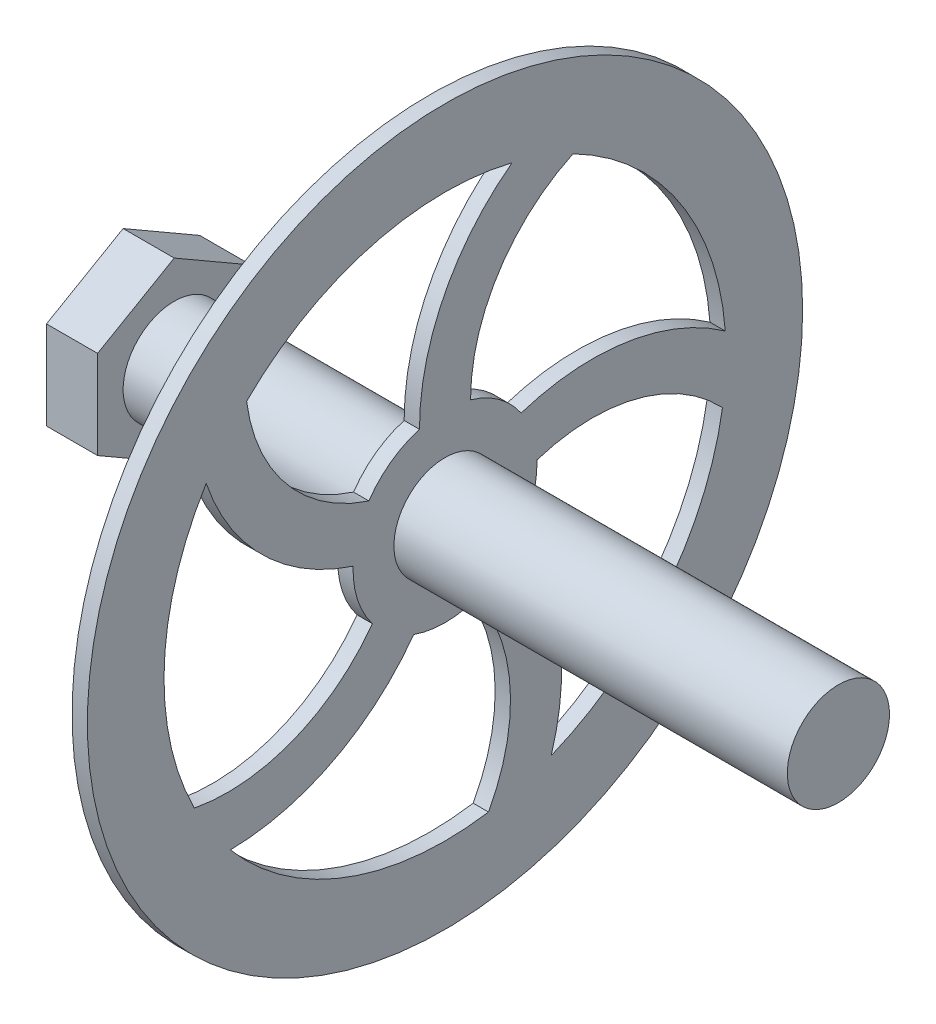
ISO-10303-21;
HEADER;
FILE_DESCRIPTION(('STEP AP214'),'2;1');
FILE_NAME('part.step','',(''),(''),'','','');
FILE_SCHEMA(('AUTOMOTIVE_DESIGN { 1 0 10303 214 1 1 1 1 }'));
ENDSEC;
DATA;
#1=APPLICATION_CONTEXT('core data for automotive mechanical design processes');
#2=APPLICATION_PROTOCOL_DEFINITION('international standard','automotive_design',2000,#1);
#3=PRODUCT_CONTEXT('',#1,'mechanical');
#4=PRODUCT('Part','Part','',(#3));
#5=PRODUCT_RELATED_PRODUCT_CATEGORY('part','',(#4));
#6=PRODUCT_DEFINITION_FORMATION('','',#4);
#7=PRODUCT_DEFINITION_CONTEXT('part definition',#1,'design');
#8=PRODUCT_DEFINITION('design','',#6,#7);
#9=PRODUCT_DEFINITION_SHAPE('','',#8);
#10=(LENGTH_UNIT() NAMED_UNIT(*) SI_UNIT(.MILLI.,.METRE.));
#11=(NAMED_UNIT(*) PLANE_ANGLE_UNIT() SI_UNIT($,.RADIAN.));
#12=(NAMED_UNIT(*) SI_UNIT($,.STERADIAN.) SOLID_ANGLE_UNIT());
#13=UNCERTAINTY_MEASURE_WITH_UNIT(LENGTH_MEASURE(1.E-05),#10,'distance_accuracy_value','');
#14=(GEOMETRIC_REPRESENTATION_CONTEXT(3) GLOBAL_UNCERTAINTY_ASSIGNED_CONTEXT((#13)) GLOBAL_UNIT_ASSIGNED_CONTEXT((#10,
#11,#12)) REPRESENTATION_CONTEXT('',''));
#15=CARTESIAN_POINT('',(0.,0.,0.));
#16=DIRECTION('',(0.,0.,1.));
#17=DIRECTION('',(1.,0.,0.));
#18=AXIS2_PLACEMENT_3D('',#15,#16,#17);
#19=CARTESIAN_POINT('',(53.,0.,0.));
#20=DIRECTION('',(1.,0.,0.));
#21=DIRECTION('',(0.,0.,-1.));
#22=AXIS2_PLACEMENT_3D('',#19,#20,#21);
#23=PLANE('',#22);
#24=CARTESIAN_POINT('',(53.,0.,0.));
#25=DIRECTION('',(1.,0.,0.));
#26=DIRECTION('',(0.,0.,-1.));
#27=AXIS2_PLACEMENT_3D('',#24,#25,#26);
#28=CIRCLE('',#27,70.);
#29=CARTESIAN_POINT('',(53.,0.,-70.));
#30=VERTEX_POINT('',#29);
#31=EDGE_CURVE('E12',#30,#30,#28,.T.);
#32=ORIENTED_EDGE('',*,*,#31,.T.);
#33=EDGE_LOOP('',(#32));
#34=FACE_BOUND('',#33,.T.);
#35=CARTESIAN_POINT('',(53.,0.,0.));
#36=DIRECTION('',(1.,0.,0.));
#37=DIRECTION('',(0.,0.,-1.));
#38=AXIS2_PLACEMENT_3D('',#35,#36,#37);
#39=CIRCLE('',#38,10.);
#40=CARTESIAN_POINT('',(53.,0.,-10.));
#41=VERTEX_POINT('',#40);
#42=EDGE_CURVE('E354',#41,#41,#39,.T.);
#43=ORIENTED_EDGE('',*,*,#42,.F.);
#44=EDGE_LOOP('',(#43));
#45=FACE_BOUND('',#44,.T.);
#46=CARTESIAN_POINT('',(53.,-32.6899293052099,-28.8334618459245));
#47=DIRECTION('',(-1.,0.,0.));
#48=DIRECTION('',(0.,0.,1.));
#49=AXIS2_PLACEMENT_3D('',#46,#47,#48);
#50=CIRCLE('',#49,45.);
#51=CARTESIAN_POINT('',(53.,10.098677939053,-14.9002249608281));
#52=VERTEX_POINT('',#51);
#53=CARTESIAN_POINT('',(53.,4.02532146187102,-54.8525002814694));
#54=VERTEX_POINT('',#53);
#55=EDGE_CURVE('E325',#52,#54,#50,.T.);
#56=ORIENTED_EDGE('',*,*,#55,.F.);
#57=CARTESIAN_POINT('',(53.,0.,0.));
#58=DIRECTION('',(-1.,0.,0.));
#59=DIRECTION('',(0.,0.,-1.));
#60=AXIS2_PLACEMENT_3D('',#57,#58,#59);
#61=CIRCLE('',#60,18.);
#62=CARTESIAN_POINT('',(53.,17.2916130168622,-5.00001192749381));
#63=VERTEX_POINT('',#62);
#64=EDGE_CURVE('E323',#63,#52,#61,.T.);
#65=ORIENTED_EDGE('',*,*,#64,.F.);
#66=CARTESIAN_POINT('',(53.,17.3205080756888,-40.));
#67=DIRECTION('',(1.,0.,0.));
#68=DIRECTION('',(0.,0.,1.));
#69=AXIS2_PLACEMENT_3D('',#66,#67,#68);
#70=CIRCLE('',#69,35.);
#71=CARTESIAN_POINT('',(53.,48.9656540357536,-25.0472498460587));
#72=VERTEX_POINT('',#71);
#73=EDGE_CURVE('E331',#72,#63,#70,.T.);
#74=ORIENTED_EDGE('',*,*,#73,.F.);
#75=CARTESIAN_POINT('',(53.,0.,0.));
#76=DIRECTION('',(1.,0.,0.));
#77=DIRECTION('',(0.,0.,-1.));
#78=AXIS2_PLACEMENT_3D('',#75,#76,#77);
#79=CIRCLE('',#78,55.);
#80=EDGE_CURVE('E328',#54,#72,#79,.T.);
#81=ORIENTED_EDGE('',*,*,#80,.F.);
#82=EDGE_LOOP('',(#56,#65,#74,#81));
#83=FACE_BOUND('',#82,.T.);
#84=CARTESIAN_POINT('',(53.,0.,0.));
#85=DIRECTION('',(1.,0.,0.));
#86=DIRECTION('',(0.,0.,-1.));
#87=AXIS2_PLACEMENT_3D('',#84,#85,#86);
#88=CIRCLE('',#87,55.);
#89=CARTESIAN_POINT('',(53.,53.4117205673136,-13.1220465644353));
#90=VERTEX_POINT('',#89);
#91=CARTESIAN_POINT('',(53.,38.9525694190994,38.8290784805697));
#92=VERTEX_POINT('',#91);
#93=EDGE_CURVE('E294',#90,#92,#88,.T.);
#94=ORIENTED_EDGE('',*,*,#93,.F.);
#95=CARTESIAN_POINT('',(53.,17.3205080756888,-40.));
#96=DIRECTION('',(-1.,0.,0.));
#97=DIRECTION('',(0.,0.,1.));
#98=AXIS2_PLACEMENT_3D('',#95,#96,#97);
#99=CIRCLE('',#98,45.);
#100=CARTESIAN_POINT('',(53.,17.291619147146,4.9999907269969));
#101=VERTEX_POINT('',#100);
#102=EDGE_CURVE('E292',#101,#90,#99,.T.);
#103=ORIENTED_EDGE('',*,*,#102,.F.);
#104=CARTESIAN_POINT('',(53.,0.,0.));
#105=DIRECTION('',(-1.,0.,0.));
#106=DIRECTION('',(0.,0.,-1.));
#107=AXIS2_PLACEMENT_3D('',#104,#105,#106);
#108=CIRCLE('',#107,18.);
#109=CARTESIAN_POINT('',(53.,10.0986962075621,14.9002125792678));
#110=VERTEX_POINT('',#109);
#111=EDGE_CURVE('E300',#110,#101,#108,.T.);
#112=ORIENTED_EDGE('',*,*,#111,.F.);
#113=CARTESIAN_POINT('',(53.,43.3945919984025,4.11210229592826));
#114=DIRECTION('',(1.,0.,0.));
#115=DIRECTION('',(0.,0.,1.));
#116=AXIS2_PLACEMENT_3D('',#113,#114,#115);
#117=CIRCLE('',#116,35.);
#118=EDGE_CURVE('E297',#92,#110,#117,.T.);
#119=ORIENTED_EDGE('',*,*,#118,.F.);
#120=EDGE_LOOP('',(#94,#103,#112,#119));
#121=FACE_BOUND('',#120,.T.);
#122=CARTESIAN_POINT('',(53.,-37.5239954761397,22.1799405658953));
#123=DIRECTION('',(-1.,0.,0.));
#124=DIRECTION('',(0.,0.,1.));
#125=AXIS2_PLACEMENT_3D('',#122,#123,#124);
#126=CIRCLE('',#125,45.);
#127=CARTESIAN_POINT('',(53.,-11.0502929393724,-14.2088361928082));
#128=VERTEX_POINT('',#127);
#129=CARTESIAN_POINT('',(53.,-50.9239350882328,-20.7786629774259));
#130=VERTEX_POINT('',#129);
#131=EDGE_CURVE('E263',#128,#130,#126,.T.);
#132=ORIENTED_EDGE('',*,*,#131,.F.);
#133=CARTESIAN_POINT('',(53.,0.,0.));
#134=DIRECTION('',(-1.,0.,0.));
#135=DIRECTION('',(0.,0.,-1.));
#136=AXIS2_PLACEMENT_3D('',#133,#134,#135);
#137=CIRCLE('',#136,18.);
#138=CARTESIAN_POINT('',(53.,0.588108357168958,-17.990389894614));
#139=VERTEX_POINT('',#138);
#140=EDGE_CURVE('E261',#139,#128,#137,.T.);
#141=ORIENTED_EDGE('',*,*,#140,.F.);
#142=CARTESIAN_POINT('',(53.,-32.6899293052099,-28.8334618459245));
#143=DIRECTION('',(1.,0.,0.));
#144=DIRECTION('',(0.,0.,1.));
#145=AXIS2_PLACEMENT_3D('',#142,#143,#144);
#146=CIRCLE('',#145,35.);
#147=CARTESIAN_POINT('',(53.,-8.69013094363495,-54.309130210145));
#148=VERTEX_POINT('',#147);
#149=EDGE_CURVE('E269',#148,#139,#146,.T.);
#150=ORIENTED_EDGE('',*,*,#149,.F.);
#151=CARTESIAN_POINT('',(53.,0.,0.));
#152=DIRECTION('',(1.,0.,0.));
#153=DIRECTION('',(0.,0.,-1.));
#154=AXIS2_PLACEMENT_3D('',#151,#152,#153);
#155=CIRCLE('',#154,55.);
#156=EDGE_CURVE('E266',#130,#148,#155,.T.);
#157=ORIENTED_EDGE('',*,*,#156,.F.);
#158=EDGE_LOOP('',(#132,#141,#150,#157));
#159=FACE_BOUND('',#158,.T.);
#160=CARTESIAN_POINT('',(53.,9.49882470725818,42.5414189841005));
#161=DIRECTION('',(-1.,0.,0.));
#162=DIRECTION('',(0.,0.,1.));
#163=AXIS2_PLACEMENT_3D('',#160,#161,#162);
#164=CIRCLE('',#163,45.);
#165=CARTESIAN_POINT('',(53.,-16.9281345612282,6.1186812530929));
#166=VERTEX_POINT('',#165);
#167=CARTESIAN_POINT('',(53.,-35.4980441872924,42.0105803206411));
#168=VERTEX_POINT('',#167);
#169=EDGE_CURVE('E232',#166,#168,#164,.T.);
#170=ORIENTED_EDGE('',*,*,#169,.F.);
#171=CARTESIAN_POINT('',(53.,0.,0.));
#172=DIRECTION('',(-1.,0.,0.));
#173=DIRECTION('',(0.,0.,-1.));
#174=AXIS2_PLACEMENT_3D('',#171,#172,#173);
#175=CIRCLE('',#174,18.);
#176=CARTESIAN_POINT('',(53.,-16.9281420630639,-6.11866049824025));
#177=VERTEX_POINT('',#176);
#178=EDGE_CURVE('E230',#177,#166,#175,.T.);
#179=ORIENTED_EDGE('',*,*,#178,.F.);
#180=CARTESIAN_POINT('',(53.,-37.5239954761397,22.1799405658953));
#181=DIRECTION('',(1.,0.,0.));
#182=DIRECTION('',(0.,0.,1.));
#183=AXIS2_PLACEMENT_3D('',#180,#181,#182);
#184=CIRCLE('',#183,35.);
#185=CARTESIAN_POINT('',(53.,-54.3364503256071,-8.51763852325466));
#186=VERTEX_POINT('',#185);
#187=EDGE_CURVE('E238',#186,#177,#184,.T.);
#188=ORIENTED_EDGE('',*,*,#187,.F.);
#189=CARTESIAN_POINT('',(53.,0.,0.));
#190=DIRECTION('',(1.,0.,0.));
#191=DIRECTION('',(0.,0.,-1.));
#192=AXIS2_PLACEMENT_3D('',#189,#190,#191);
#193=CIRCLE('',#192,55.);
#194=EDGE_CURVE('E235',#168,#186,#193,.T.);
#195=ORIENTED_EDGE('',*,*,#194,.F.);
#196=EDGE_LOOP('',(#170,#179,#188,#195));
#197=FACE_BOUND('',#196,.T.);
#198=CARTESIAN_POINT('',(53.,43.3945919984025,4.11210229592826));
#199=DIRECTION('',(-1.,0.,0.));
#200=DIRECTION('',(0.,0.,1.));
#201=AXIS2_PLACEMENT_3D('',#198,#199,#200);
#202=CIRCLE('',#201,45.0000000000002);
#203=CARTESIAN_POINT('',(53.,0.588130414401568,17.9903891735465));
#204=VERTEX_POINT('',#203);
#205=CARTESIAN_POINT('',(53.,28.9849372463393,46.7426295026896));
#206=VERTEX_POINT('',#205);
#207=EDGE_CURVE('E202',#204,#206,#202,.T.);
#208=ORIENTED_EDGE('',*,*,#207,.F.);
#209=CARTESIAN_POINT('',(53.,0.,0.));
#210=DIRECTION('',(-1.,0.,0.));
#211=DIRECTION('',(0.,0.,-1.));
#212=AXIS2_PLACEMENT_3D('',#209,#210,#211);
#213=CIRCLE('',#212,18.);
#214=CARTESIAN_POINT('',(53.,-11.0502755185293,14.2088497410801));
#215=VERTEX_POINT('',#214);
#216=EDGE_CURVE('E194',#215,#204,#213,.T.);
#217=ORIENTED_EDGE('',*,*,#216,.F.);
#218=CARTESIAN_POINT('',(53.,9.49882470725818,42.5414189841005));
#219=DIRECTION('',(1.,0.,0.));
#220=DIRECTION('',(0.,0.,1.));
#221=AXIS2_PLACEMENT_3D('',#218,#219,#220);
#222=CIRCLE('',#221,35.);
#223=CARTESIAN_POINT('',(53.,-24.8916421856107,49.0449400988881));
#224=VERTEX_POINT('',#223);
#225=EDGE_CURVE('E216',#224,#215,#222,.T.);
#226=ORIENTED_EDGE('',*,*,#225,.F.);
#227=CARTESIAN_POINT('',(53.,0.,0.));
#228=DIRECTION('',(1.,0.,0.));
#229=DIRECTION('',(0.,0.,-1.));
#230=AXIS2_PLACEMENT_3D('',#227,#228,#229);
#231=CIRCLE('',#230,54.9999999999994);
#232=EDGE_CURVE('E214',#206,#224,#231,.T.);
#233=ORIENTED_EDGE('',*,*,#232,.F.);
#234=EDGE_LOOP('',(#208,#217,#226,#233));
#235=FACE_BOUND('',#234,.T.);
#236=ADVANCED_FACE('F57',(#34,#45,#83,#121,#159,#197,#235),#23,.T.);
#237=CARTESIAN_POINT('',(50.,0.,0.));
#238=DIRECTION('',(1.,0.,0.));
#239=DIRECTION('',(0.,0.,-1.));
#240=AXIS2_PLACEMENT_3D('',#237,#238,#239);
#241=PLANE('',#240);
#242=CARTESIAN_POINT('',(50.,0.,0.));
#243=DIRECTION('',(-1.,0.,0.));
#244=DIRECTION('',(0.,0.,-1.));
#245=AXIS2_PLACEMENT_3D('',#242,#243,#244);
#246=CIRCLE('',#245,18.);
#247=CARTESIAN_POINT('',(50.,-16.9281420630639,-6.11866049824025));
#248=VERTEX_POINT('',#247);
#249=CARTESIAN_POINT('',(50.,-16.9281345612282,6.1186812530929));
#250=VERTEX_POINT('',#249);
#251=EDGE_CURVE('E210',#248,#250,#246,.T.);
#252=ORIENTED_EDGE('',*,*,#251,.T.);
#253=CARTESIAN_POINT('',(50.,9.49882470725818,42.5414189841005));
#254=DIRECTION('',(-1.,0.,0.));
#255=DIRECTION('',(0.,0.,1.));
#256=AXIS2_PLACEMENT_3D('',#253,#254,#255);
#257=CIRCLE('',#256,45.);
#258=CARTESIAN_POINT('',(50.,-35.4980441872924,42.0105803206411));
#259=VERTEX_POINT('',#258);
#260=EDGE_CURVE('E243',#250,#259,#257,.T.);
#261=ORIENTED_EDGE('',*,*,#260,.T.);
#262=CARTESIAN_POINT('',(50.,0.,0.));
#263=DIRECTION('',(1.,0.,0.));
#264=DIRECTION('',(0.,0.,-1.));
#265=AXIS2_PLACEMENT_3D('',#262,#263,#264);
#266=CIRCLE('',#265,55.);
#267=CARTESIAN_POINT('',(50.,-54.3364503256071,-8.51763852325465));
#268=VERTEX_POINT('',#267);
#269=EDGE_CURVE('E246',#259,#268,#266,.T.);
#270=ORIENTED_EDGE('',*,*,#269,.T.);
#271=CARTESIAN_POINT('',(50.,-37.5239954761397,22.1799405658953));
#272=DIRECTION('',(1.,0.,0.));
#273=DIRECTION('',(0.,0.,1.));
#274=AXIS2_PLACEMENT_3D('',#271,#272,#273);
#275=CIRCLE('',#274,35.);
#276=EDGE_CURVE('E233',#268,#248,#275,.T.);
#277=ORIENTED_EDGE('',*,*,#276,.T.);
#278=EDGE_LOOP('',(#252,#261,#270,#277));
#279=FACE_BOUND('',#278,.T.);
#280=CARTESIAN_POINT('',(50.,17.3205080756888,-40.));
#281=DIRECTION('',(-1.,0.,0.));
#282=DIRECTION('',(0.,0.,1.));
#283=AXIS2_PLACEMENT_3D('',#280,#281,#282);
#284=CIRCLE('',#283,45.);
#285=CARTESIAN_POINT('',(50.,17.291619147146,4.9999907269969));
#286=VERTEX_POINT('',#285);
#287=CARTESIAN_POINT('',(50.,53.4117205673136,-13.1220465644353));
#288=VERTEX_POINT('',#287);
#289=EDGE_CURVE('E291',#286,#288,#284,.T.);
#290=ORIENTED_EDGE('',*,*,#289,.T.);
#291=CARTESIAN_POINT('',(50.,0.,0.));
#292=DIRECTION('',(1.,0.,0.));
#293=DIRECTION('',(0.,0.,-1.));
#294=AXIS2_PLACEMENT_3D('',#291,#292,#293);
#295=CIRCLE('',#294,55.);
#296=CARTESIAN_POINT('',(50.,38.9525694190994,38.8290784805697));
#297=VERTEX_POINT('',#296);
#298=EDGE_CURVE('E305',#288,#297,#295,.T.);
#299=ORIENTED_EDGE('',*,*,#298,.T.);
#300=CARTESIAN_POINT('',(50.,43.3945919984025,4.11210229592826));
#301=DIRECTION('',(1.,0.,0.));
#302=DIRECTION('',(0.,0.,1.));
#303=AXIS2_PLACEMENT_3D('',#300,#301,#302);
#304=CIRCLE('',#303,35.);
#305=CARTESIAN_POINT('',(50.,10.0986962075621,14.9002125792678));
#306=VERTEX_POINT('',#305);
#307=EDGE_CURVE('E308',#297,#306,#304,.T.);
#308=ORIENTED_EDGE('',*,*,#307,.T.);
#309=CARTESIAN_POINT('',(50.,0.,0.));
#310=DIRECTION('',(-1.,0.,0.));
#311=DIRECTION('',(0.,0.,-1.));
#312=AXIS2_PLACEMENT_3D('',#309,#310,#311);
#313=CIRCLE('',#312,18.);
#314=EDGE_CURVE('E295',#306,#286,#313,.T.);
#315=ORIENTED_EDGE('',*,*,#314,.T.);
#316=EDGE_LOOP('',(#290,#299,#308,#315));
#317=FACE_BOUND('',#316,.T.);
#318=CARTESIAN_POINT('',(50.,0.,0.));
#319=DIRECTION('',(1.,0.,0.));
#320=DIRECTION('',(0.,0.,-1.));
#321=AXIS2_PLACEMENT_3D('',#318,#319,#320);
#322=CIRCLE('',#321,10.);
#323=CARTESIAN_POINT('',(50.,0.,-10.));
#324=VERTEX_POINT('',#323);
#325=EDGE_CURVE('E353',#324,#324,#322,.T.);
#326=ORIENTED_EDGE('',*,*,#325,.T.);
#327=EDGE_LOOP('',(#326));
#328=FACE_BOUND('',#327,.T.);
#329=CARTESIAN_POINT('',(50.,0.,0.));
#330=DIRECTION('',(1.,0.,0.));
#331=DIRECTION('',(0.,0.,-1.));
#332=AXIS2_PLACEMENT_3D('',#329,#330,#331);
#333=CIRCLE('',#332,70.);
#334=CARTESIAN_POINT('',(50.,0.,-70.));
#335=VERTEX_POINT('',#334);
#336=EDGE_CURVE('E61',#335,#335,#333,.T.);
#337=ORIENTED_EDGE('',*,*,#336,.F.);
#338=EDGE_LOOP('',(#337));
#339=FACE_BOUND('',#338,.T.);
#340=CARTESIAN_POINT('',(50.,0.,0.));
#341=DIRECTION('',(-1.,0.,0.));
#342=DIRECTION('',(0.,0.,-1.));
#343=AXIS2_PLACEMENT_3D('',#340,#341,#342);
#344=CIRCLE('',#343,18.);
#345=CARTESIAN_POINT('',(50.,17.2916130168622,-5.00001192749381));
#346=VERTEX_POINT('',#345);
#347=CARTESIAN_POINT('',(50.,10.098677939053,-14.9002249608281));
#348=VERTEX_POINT('',#347);
#349=EDGE_CURVE('E322',#346,#348,#344,.T.);
#350=ORIENTED_EDGE('',*,*,#349,.T.);
#351=CARTESIAN_POINT('',(50.,-32.6899293052099,-28.8334618459245));
#352=DIRECTION('',(-1.,0.,0.));
#353=DIRECTION('',(0.,0.,1.));
#354=AXIS2_PLACEMENT_3D('',#351,#352,#353);
#355=CIRCLE('',#354,45.);
#356=CARTESIAN_POINT('',(50.,4.02532146187102,-54.8525002814694));
#357=VERTEX_POINT('',#356);
#358=EDGE_CURVE('E336',#348,#357,#355,.T.);
#359=ORIENTED_EDGE('',*,*,#358,.T.);
#360=CARTESIAN_POINT('',(50.,0.,0.));
#361=DIRECTION('',(1.,0.,0.));
#362=DIRECTION('',(0.,0.,-1.));
#363=AXIS2_PLACEMENT_3D('',#360,#361,#362);
#364=CIRCLE('',#363,55.);
#365=CARTESIAN_POINT('',(50.,48.9656540357536,-25.0472498460587));
#366=VERTEX_POINT('',#365);
#367=EDGE_CURVE('E339',#357,#366,#364,.T.);
#368=ORIENTED_EDGE('',*,*,#367,.T.);
#369=CARTESIAN_POINT('',(50.,17.3205080756888,-40.));
#370=DIRECTION('',(1.,0.,0.));
#371=DIRECTION('',(0.,0.,1.));
#372=AXIS2_PLACEMENT_3D('',#369,#370,#371);
#373=CIRCLE('',#372,35.);
#374=EDGE_CURVE('E326',#366,#346,#373,.T.);
#375=ORIENTED_EDGE('',*,*,#374,.T.);
#376=EDGE_LOOP('',(#350,#359,#368,#375));
#377=FACE_BOUND('',#376,.T.);
#378=CARTESIAN_POINT('',(50.,0.,0.));
#379=DIRECTION('',(-1.,0.,0.));
#380=DIRECTION('',(0.,0.,-1.));
#381=AXIS2_PLACEMENT_3D('',#378,#379,#380);
#382=CIRCLE('',#381,18.);
#383=CARTESIAN_POINT('',(50.,0.588108357168958,-17.990389894614));
#384=VERTEX_POINT('',#383);
#385=CARTESIAN_POINT('',(50.,-11.0502929393724,-14.2088361928082));
#386=VERTEX_POINT('',#385);
#387=EDGE_CURVE('E260',#384,#386,#382,.T.);
#388=ORIENTED_EDGE('',*,*,#387,.T.);
#389=CARTESIAN_POINT('',(50.,-37.5239954761397,22.1799405658953));
#390=DIRECTION('',(-1.,0.,0.));
#391=DIRECTION('',(0.,0.,1.));
#392=AXIS2_PLACEMENT_3D('',#389,#390,#391);
#393=CIRCLE('',#392,45.);
#394=CARTESIAN_POINT('',(50.,-50.9239350882328,-20.7786629774259));
#395=VERTEX_POINT('',#394);
#396=EDGE_CURVE('E274',#386,#395,#393,.T.);
#397=ORIENTED_EDGE('',*,*,#396,.T.);
#398=CARTESIAN_POINT('',(50.,0.,0.));
#399=DIRECTION('',(1.,0.,0.));
#400=DIRECTION('',(0.,0.,-1.));
#401=AXIS2_PLACEMENT_3D('',#398,#399,#400);
#402=CIRCLE('',#401,55.);
#403=CARTESIAN_POINT('',(50.,-8.69013094363495,-54.309130210145));
#404=VERTEX_POINT('',#403);
#405=EDGE_CURVE('E277',#395,#404,#402,.T.);
#406=ORIENTED_EDGE('',*,*,#405,.T.);
#407=CARTESIAN_POINT('',(50.,-32.6899293052099,-28.8334618459245));
#408=DIRECTION('',(1.,0.,0.));
#409=DIRECTION('',(0.,0.,1.));
#410=AXIS2_PLACEMENT_3D('',#407,#408,#409);
#411=CIRCLE('',#410,35.);
#412=EDGE_CURVE('E264',#404,#384,#411,.T.);
#413=ORIENTED_EDGE('',*,*,#412,.T.);
#414=EDGE_LOOP('',(#388,#397,#406,#413));
#415=FACE_BOUND('',#414,.T.);
#416=CARTESIAN_POINT('',(50.,0.,0.));
#417=DIRECTION('',(-1.,0.,0.));
#418=DIRECTION('',(0.,0.,-1.));
#419=AXIS2_PLACEMENT_3D('',#416,#417,#418);
#420=CIRCLE('',#419,18.);
#421=CARTESIAN_POINT('',(50.,-11.0502755185293,14.2088497410801));
#422=VERTEX_POINT('',#421);
#423=CARTESIAN_POINT('',(50.,0.588130414401568,17.9903891735465));
#424=VERTEX_POINT('',#423);
#425=EDGE_CURVE('E80',#422,#424,#420,.T.);
#426=ORIENTED_EDGE('',*,*,#425,.T.);
#427=CARTESIAN_POINT('',(50.,43.3945919984025,4.11210229592826));
#428=DIRECTION('',(-1.,0.,0.));
#429=DIRECTION('',(0.,0.,1.));
#430=AXIS2_PLACEMENT_3D('',#427,#428,#429);
#431=CIRCLE('',#430,45.0000000000002);
#432=CARTESIAN_POINT('',(50.,28.9849372463393,46.7426295026896));
#433=VERTEX_POINT('',#432);
#434=EDGE_CURVE('E209',#424,#433,#431,.T.);
#435=ORIENTED_EDGE('',*,*,#434,.T.);
#436=CARTESIAN_POINT('',(50.,0.,0.));
#437=DIRECTION('',(1.,0.,0.));
#438=DIRECTION('',(0.,0.,-1.));
#439=AXIS2_PLACEMENT_3D('',#436,#437,#438);
#440=CIRCLE('',#439,54.9999999999994);
#441=CARTESIAN_POINT('',(50.,-24.8916421856107,49.0449400988881));
#442=VERTEX_POINT('',#441);
#443=EDGE_CURVE('E222',#433,#442,#440,.T.);
#444=ORIENTED_EDGE('',*,*,#443,.T.);
#445=CARTESIAN_POINT('',(50.,9.49882470725818,42.5414189841005));
#446=DIRECTION('',(1.,0.,0.));
#447=DIRECTION('',(0.,0.,1.));
#448=AXIS2_PLACEMENT_3D('',#445,#446,#447);
#449=CIRCLE('',#448,35.);
#450=EDGE_CURVE('E203',#442,#422,#449,.T.);
#451=ORIENTED_EDGE('',*,*,#450,.T.);
#452=EDGE_LOOP('',(#426,#435,#444,#451));
#453=FACE_BOUND('',#452,.T.);
#454=ADVANCED_FACE('F360',(#279,#317,#328,#339,#377,#415,#453),#241,.F.);
#455=CARTESIAN_POINT('',(53.,0.,0.));
#456=DIRECTION('',(-1.,0.,0.));
#457=DIRECTION('',(0.,0.,1.));
#458=AXIS2_PLACEMENT_3D('',#455,#456,#457);
#459=CYLINDRICAL_SURFACE('',#458,70.);
#460=ORIENTED_EDGE('',*,*,#31,.F.);
#461=EDGE_LOOP('',(#460));
#462=FACE_BOUND('',#461,.T.);
#463=ORIENTED_EDGE('',*,*,#336,.T.);
#464=EDGE_LOOP('',(#463));
#465=FACE_BOUND('',#464,.T.);
#466=ADVANCED_FACE('F59',(#462,#465),#459,.T.);
#467=CARTESIAN_POINT('',(53.,0.,0.));
#468=DIRECTION('',(-1.,0.,0.));
#469=DIRECTION('',(0.,0.,1.));
#470=AXIS2_PLACEMENT_3D('',#467,#468,#469);
#471=CYLINDRICAL_SURFACE('',#470,10.);
#472=ORIENTED_EDGE('',*,*,#42,.T.);
#473=EDGE_LOOP('',(#472));
#474=FACE_BOUND('',#473,.T.);
#475=ORIENTED_EDGE('',*,*,#325,.F.);
#476=EDGE_LOOP('',(#475));
#477=FACE_BOUND('',#476,.T.);
#478=ADVANCED_FACE('F363',(#474,#477),#471,.F.);
#479=CARTESIAN_POINT('',(53.,0.,0.));
#480=DIRECTION('',(-1.,0.,0.));
#481=DIRECTION('',(0.,0.,1.));
#482=AXIS2_PLACEMENT_3D('',#479,#480,#481);
#483=CYLINDRICAL_SURFACE('',#482,18.);
#484=ORIENTED_EDGE('',*,*,#349,.F.);
#485=DIRECTION('',(-1.,0.,0.));
#486=VECTOR('',#485,1.);
#487=CARTESIAN_POINT('',(53.,17.2916130168622,-5.00001192749381));
#488=LINE('',#487,#486);
#489=EDGE_CURVE('E333',#63,#346,#488,.T.);
#490=ORIENTED_EDGE('',*,*,#489,.F.);
#491=ORIENTED_EDGE('',*,*,#64,.T.);
#492=DIRECTION('',(-1.,0.,0.));
#493=VECTOR('',#492,1.);
#494=CARTESIAN_POINT('',(53.,10.098677939053,-14.9002249608281));
#495=LINE('',#494,#493);
#496=EDGE_CURVE('E350',#52,#348,#495,.T.);
#497=ORIENTED_EDGE('',*,*,#496,.T.);
#498=EDGE_LOOP('',(#484,#490,#491,#497));
#499=FACE_BOUND('',#498,.T.);
#500=ADVANCED_FACE('F365',(#499),#483,.T.);
#501=CARTESIAN_POINT('',(53.,-32.6899293052099,-28.8334618459245));
#502=DIRECTION('',(-1.,0.,0.));
#503=DIRECTION('',(0.,0.,1.));
#504=AXIS2_PLACEMENT_3D('',#501,#502,#503);
#505=CYLINDRICAL_SURFACE('',#504,45.);
#506=ORIENTED_EDGE('',*,*,#358,.F.);
#507=ORIENTED_EDGE('',*,*,#496,.F.);
#508=ORIENTED_EDGE('',*,*,#55,.T.);
#509=DIRECTION('',(-1.,0.,0.));
#510=VECTOR('',#509,1.);
#511=CARTESIAN_POINT('',(53.,4.02532146187102,-54.8525002814694));
#512=LINE('',#511,#510);
#513=EDGE_CURVE('E348',#54,#357,#512,.T.);
#514=ORIENTED_EDGE('',*,*,#513,.T.);
#515=EDGE_LOOP('',(#506,#507,#508,#514));
#516=FACE_BOUND('',#515,.T.);
#517=ADVANCED_FACE('F372',(#516),#505,.T.);
#518=CARTESIAN_POINT('',(53.,0.,0.));
#519=DIRECTION('',(-1.,0.,0.));
#520=DIRECTION('',(0.,0.,1.));
#521=AXIS2_PLACEMENT_3D('',#518,#519,#520);
#522=CYLINDRICAL_SURFACE('',#521,55.);
#523=ORIENTED_EDGE('',*,*,#367,.F.);
#524=ORIENTED_EDGE('',*,*,#513,.F.);
#525=ORIENTED_EDGE('',*,*,#80,.T.);
#526=DIRECTION('',(-1.,0.,0.));
#527=VECTOR('',#526,1.);
#528=CARTESIAN_POINT('',(53.,48.9656540357536,-25.0472498460587));
#529=LINE('',#528,#527);
#530=EDGE_CURVE('E346',#72,#366,#529,.T.);
#531=ORIENTED_EDGE('',*,*,#530,.T.);
#532=EDGE_LOOP('',(#523,#524,#525,#531));
#533=FACE_BOUND('',#532,.T.);
#534=ADVANCED_FACE('F466',(#533),#522,.F.);
#535=CARTESIAN_POINT('',(53.,17.3205080756888,-40.));
#536=DIRECTION('',(-1.,0.,0.));
#537=DIRECTION('',(0.,0.,1.));
#538=AXIS2_PLACEMENT_3D('',#535,#536,#537);
#539=CYLINDRICAL_SURFACE('',#538,35.);
#540=ORIENTED_EDGE('',*,*,#374,.F.);
#541=ORIENTED_EDGE('',*,*,#530,.F.);
#542=ORIENTED_EDGE('',*,*,#73,.T.);
#543=ORIENTED_EDGE('',*,*,#489,.T.);
#544=EDGE_LOOP('',(#540,#541,#542,#543));
#545=FACE_BOUND('',#544,.T.);
#546=ADVANCED_FACE('F462',(#545),#539,.F.);
#547=CARTESIAN_POINT('',(53.,17.3205080756888,-40.));
#548=DIRECTION('',(-1.,0.,0.));
#549=DIRECTION('',(0.,0.,1.));
#550=AXIS2_PLACEMENT_3D('',#547,#548,#549);
#551=CYLINDRICAL_SURFACE('',#550,45.);
#552=ORIENTED_EDGE('',*,*,#289,.F.);
#553=DIRECTION('',(-1.,0.,0.));
#554=VECTOR('',#553,1.);
#555=CARTESIAN_POINT('',(53.,17.291619147146,4.9999907269969));
#556=LINE('',#555,#554);
#557=EDGE_CURVE('E302',#101,#286,#556,.T.);
#558=ORIENTED_EDGE('',*,*,#557,.F.);
#559=ORIENTED_EDGE('',*,*,#102,.T.);
#560=DIRECTION('',(-1.,0.,0.));
#561=VECTOR('',#560,1.);
#562=CARTESIAN_POINT('',(53.,53.4117205673136,-13.1220465644353));
#563=LINE('',#562,#561);
#564=EDGE_CURVE('E319',#90,#288,#563,.T.);
#565=ORIENTED_EDGE('',*,*,#564,.T.);
#566=EDGE_LOOP('',(#552,#558,#559,#565));
#567=FACE_BOUND('',#566,.T.);
#568=ADVANCED_FACE('F458',(#567),#551,.T.);
#569=CARTESIAN_POINT('',(53.,0.,0.));
#570=DIRECTION('',(-1.,0.,0.));
#571=DIRECTION('',(0.,0.,1.));
#572=AXIS2_PLACEMENT_3D('',#569,#570,#571);
#573=CYLINDRICAL_SURFACE('',#572,55.);
#574=ORIENTED_EDGE('',*,*,#298,.F.);
#575=ORIENTED_EDGE('',*,*,#564,.F.);
#576=ORIENTED_EDGE('',*,*,#93,.T.);
#577=DIRECTION('',(-1.,0.,0.));
#578=VECTOR('',#577,1.);
#579=CARTESIAN_POINT('',(53.,38.9525694190994,38.8290784805697));
#580=LINE('',#579,#578);
#581=EDGE_CURVE('E317',#92,#297,#580,.T.);
#582=ORIENTED_EDGE('',*,*,#581,.T.);
#583=EDGE_LOOP('',(#574,#575,#576,#582));
#584=FACE_BOUND('',#583,.T.);
#585=ADVANCED_FACE('F454',(#584),#573,.F.);
#586=CARTESIAN_POINT('',(53.,43.3945919984025,4.11210229592826));
#587=DIRECTION('',(-1.,0.,0.));
#588=DIRECTION('',(0.,0.,1.));
#589=AXIS2_PLACEMENT_3D('',#586,#587,#588);
#590=CYLINDRICAL_SURFACE('',#589,35.);
#591=ORIENTED_EDGE('',*,*,#307,.F.);
#592=ORIENTED_EDGE('',*,*,#581,.F.);
#593=ORIENTED_EDGE('',*,*,#118,.T.);
#594=DIRECTION('',(-1.,0.,0.));
#595=VECTOR('',#594,1.);
#596=CARTESIAN_POINT('',(53.,10.0986962075621,14.9002125792678));
#597=LINE('',#596,#595);
#598=EDGE_CURVE('E315',#110,#306,#597,.T.);
#599=ORIENTED_EDGE('',*,*,#598,.T.);
#600=EDGE_LOOP('',(#591,#592,#593,#599));
#601=FACE_BOUND('',#600,.T.);
#602=ADVANCED_FACE('F450',(#601),#590,.F.);
#603=CARTESIAN_POINT('',(53.,0.,0.));
#604=DIRECTION('',(-1.,0.,0.));
#605=DIRECTION('',(0.,0.,1.));
#606=AXIS2_PLACEMENT_3D('',#603,#604,#605);
#607=CYLINDRICAL_SURFACE('',#606,18.);
#608=ORIENTED_EDGE('',*,*,#314,.F.);
#609=ORIENTED_EDGE('',*,*,#598,.F.);
#610=ORIENTED_EDGE('',*,*,#111,.T.);
#611=ORIENTED_EDGE('',*,*,#557,.T.);
#612=EDGE_LOOP('',(#608,#609,#610,#611));
#613=FACE_BOUND('',#612,.T.);
#614=ADVANCED_FACE('F446',(#613),#607,.T.);
#615=CARTESIAN_POINT('',(53.,0.,0.));
#616=DIRECTION('',(-1.,0.,0.));
#617=DIRECTION('',(0.,0.,1.));
#618=AXIS2_PLACEMENT_3D('',#615,#616,#617);
#619=CYLINDRICAL_SURFACE('',#618,18.);
#620=ORIENTED_EDGE('',*,*,#387,.F.);
#621=DIRECTION('',(-1.,0.,0.));
#622=VECTOR('',#621,1.);
#623=CARTESIAN_POINT('',(53.,0.588108357168958,-17.990389894614));
#624=LINE('',#623,#622);
#625=EDGE_CURVE('E271',#139,#384,#624,.T.);
#626=ORIENTED_EDGE('',*,*,#625,.F.);
#627=ORIENTED_EDGE('',*,*,#140,.T.);
#628=DIRECTION('',(-1.,0.,0.));
#629=VECTOR('',#628,1.);
#630=CARTESIAN_POINT('',(53.,-11.0502929393724,-14.2088361928082));
#631=LINE('',#630,#629);
#632=EDGE_CURVE('E288',#128,#386,#631,.T.);
#633=ORIENTED_EDGE('',*,*,#632,.T.);
#634=EDGE_LOOP('',(#620,#626,#627,#633));
#635=FACE_BOUND('',#634,.T.);
#636=ADVANCED_FACE('F442',(#635),#619,.T.);
#637=CARTESIAN_POINT('',(53.,-37.5239954761397,22.1799405658953));
#638=DIRECTION('',(-1.,0.,0.));
#639=DIRECTION('',(0.,0.,1.));
#640=AXIS2_PLACEMENT_3D('',#637,#638,#639);
#641=CYLINDRICAL_SURFACE('',#640,45.);
#642=ORIENTED_EDGE('',*,*,#396,.F.);
#643=ORIENTED_EDGE('',*,*,#632,.F.);
#644=ORIENTED_EDGE('',*,*,#131,.T.);
#645=DIRECTION('',(-1.,0.,0.));
#646=VECTOR('',#645,1.);
#647=CARTESIAN_POINT('',(53.,-50.9239350882328,-20.7786629774259));
#648=LINE('',#647,#646);
#649=EDGE_CURVE('E286',#130,#395,#648,.T.);
#650=ORIENTED_EDGE('',*,*,#649,.T.);
#651=EDGE_LOOP('',(#642,#643,#644,#650));
#652=FACE_BOUND('',#651,.T.);
#653=ADVANCED_FACE('F438',(#652),#641,.T.);
#654=CARTESIAN_POINT('',(53.,0.,0.));
#655=DIRECTION('',(-1.,0.,0.));
#656=DIRECTION('',(0.,0.,1.));
#657=AXIS2_PLACEMENT_3D('',#654,#655,#656);
#658=CYLINDRICAL_SURFACE('',#657,55.);
#659=ORIENTED_EDGE('',*,*,#405,.F.);
#660=ORIENTED_EDGE('',*,*,#649,.F.);
#661=ORIENTED_EDGE('',*,*,#156,.T.);
#662=DIRECTION('',(-1.,0.,0.));
#663=VECTOR('',#662,1.);
#664=CARTESIAN_POINT('',(53.,-8.69013094363495,-54.309130210145));
#665=LINE('',#664,#663);
#666=EDGE_CURVE('E284',#148,#404,#665,.T.);
#667=ORIENTED_EDGE('',*,*,#666,.T.);
#668=EDGE_LOOP('',(#659,#660,#661,#667));
#669=FACE_BOUND('',#668,.T.);
#670=ADVANCED_FACE('F434',(#669),#658,.F.);
#671=CARTESIAN_POINT('',(53.,-32.6899293052099,-28.8334618459245));
#672=DIRECTION('',(-1.,0.,0.));
#673=DIRECTION('',(0.,0.,1.));
#674=AXIS2_PLACEMENT_3D('',#671,#672,#673);
#675=CYLINDRICAL_SURFACE('',#674,35.);
#676=ORIENTED_EDGE('',*,*,#412,.F.);
#677=ORIENTED_EDGE('',*,*,#666,.F.);
#678=ORIENTED_EDGE('',*,*,#149,.T.);
#679=ORIENTED_EDGE('',*,*,#625,.T.);
#680=EDGE_LOOP('',(#676,#677,#678,#679));
#681=FACE_BOUND('',#680,.T.);
#682=ADVANCED_FACE('F431',(#681),#675,.F.);
#683=CARTESIAN_POINT('',(53.,0.,0.));
#684=DIRECTION('',(-1.,0.,0.));
#685=DIRECTION('',(0.,0.,1.));
#686=AXIS2_PLACEMENT_3D('',#683,#684,#685);
#687=CYLINDRICAL_SURFACE('',#686,18.);
#688=ORIENTED_EDGE('',*,*,#251,.F.);
#689=DIRECTION('',(-1.,0.,0.));
#690=VECTOR('',#689,1.);
#691=CARTESIAN_POINT('',(53.,-16.9281420630639,-6.11866049824025));
#692=LINE('',#691,#690);
#693=EDGE_CURVE('E240',#177,#248,#692,.T.);
#694=ORIENTED_EDGE('',*,*,#693,.F.);
#695=ORIENTED_EDGE('',*,*,#178,.T.);
#696=DIRECTION('',(-1.,0.,0.));
#697=VECTOR('',#696,1.);
#698=CARTESIAN_POINT('',(53.,-16.9281345612282,6.1186812530929));
#699=LINE('',#698,#697);
#700=EDGE_CURVE('E257',#166,#250,#699,.T.);
#701=ORIENTED_EDGE('',*,*,#700,.T.);
#702=EDGE_LOOP('',(#688,#694,#695,#701));
#703=FACE_BOUND('',#702,.T.);
#704=ADVANCED_FACE('F413',(#703),#687,.T.);
#705=CARTESIAN_POINT('',(53.,9.49882470725818,42.5414189841005));
#706=DIRECTION('',(-1.,0.,0.));
#707=DIRECTION('',(0.,0.,1.));
#708=AXIS2_PLACEMENT_3D('',#705,#706,#707);
#709=CYLINDRICAL_SURFACE('',#708,45.);
#710=ORIENTED_EDGE('',*,*,#260,.F.);
#711=ORIENTED_EDGE('',*,*,#700,.F.);
#712=ORIENTED_EDGE('',*,*,#169,.T.);
#713=DIRECTION('',(-1.,0.,0.));
#714=VECTOR('',#713,1.);
#715=CARTESIAN_POINT('',(53.,-35.4980441872924,42.0105803206411));
#716=LINE('',#715,#714);
#717=EDGE_CURVE('E255',#168,#259,#716,.T.);
#718=ORIENTED_EDGE('',*,*,#717,.T.);
#719=EDGE_LOOP('',(#710,#711,#712,#718));
#720=FACE_BOUND('',#719,.T.);
#721=ADVANCED_FACE('F406',(#720),#709,.T.);
#722=CARTESIAN_POINT('',(53.,0.,0.));
#723=DIRECTION('',(-1.,0.,0.));
#724=DIRECTION('',(0.,0.,1.));
#725=AXIS2_PLACEMENT_3D('',#722,#723,#724);
#726=CYLINDRICAL_SURFACE('',#725,55.);
#727=ORIENTED_EDGE('',*,*,#269,.F.);
#728=ORIENTED_EDGE('',*,*,#717,.F.);
#729=ORIENTED_EDGE('',*,*,#194,.T.);
#730=DIRECTION('',(-1.,0.,0.));
#731=VECTOR('',#730,1.);
#732=CARTESIAN_POINT('',(53.,-54.3364503256071,-8.51763852325465));
#733=LINE('',#732,#731);
#734=EDGE_CURVE('E253',#186,#268,#733,.T.);
#735=ORIENTED_EDGE('',*,*,#734,.T.);
#736=EDGE_LOOP('',(#727,#728,#729,#735));
#737=FACE_BOUND('',#736,.T.);
#738=ADVANCED_FACE('F409',(#737),#726,.F.);
#739=CARTESIAN_POINT('',(53.,-37.5239954761397,22.1799405658953));
#740=DIRECTION('',(-1.,0.,0.));
#741=DIRECTION('',(0.,0.,1.));
#742=AXIS2_PLACEMENT_3D('',#739,#740,#741);
#743=CYLINDRICAL_SURFACE('',#742,35.);
#744=ORIENTED_EDGE('',*,*,#276,.F.);
#745=ORIENTED_EDGE('',*,*,#734,.F.);
#746=ORIENTED_EDGE('',*,*,#187,.T.);
#747=ORIENTED_EDGE('',*,*,#693,.T.);
#748=EDGE_LOOP('',(#744,#745,#746,#747));
#749=FACE_BOUND('',#748,.T.);
#750=ADVANCED_FACE('F416',(#749),#743,.F.);
#751=CARTESIAN_POINT('',(53.,0.,0.));
#752=DIRECTION('',(-1.,0.,0.));
#753=DIRECTION('',(0.,0.,1.));
#754=AXIS2_PLACEMENT_3D('',#751,#752,#753);
#755=CYLINDRICAL_SURFACE('',#754,18.);
#756=ORIENTED_EDGE('',*,*,#425,.F.);
#757=DIRECTION('',(-1.,0.,0.));
#758=VECTOR('',#757,1.);
#759=CARTESIAN_POINT('',(53.,-11.0502755185293,14.2088497410801));
#760=LINE('',#759,#758);
#761=EDGE_CURVE('E198',#215,#422,#760,.T.);
#762=ORIENTED_EDGE('',*,*,#761,.F.);
#763=ORIENTED_EDGE('',*,*,#216,.T.);
#764=DIRECTION('',(-1.,0.,0.));
#765=VECTOR('',#764,1.);
#766=CARTESIAN_POINT('',(53.,0.588130414401568,17.9903891735465));
#767=LINE('',#766,#765);
#768=EDGE_CURVE('E197',#204,#424,#767,.T.);
#769=ORIENTED_EDGE('',*,*,#768,.T.);
#770=EDGE_LOOP('',(#756,#762,#763,#769));
#771=FACE_BOUND('',#770,.T.);
#772=ADVANCED_FACE('F196',(#771),#755,.T.);
#773=CARTESIAN_POINT('',(53.,43.3945919984025,4.11210229592826));
#774=DIRECTION('',(-1.,0.,0.));
#775=DIRECTION('',(0.,0.,1.));
#776=AXIS2_PLACEMENT_3D('',#773,#774,#775);
#777=CYLINDRICAL_SURFACE('',#776,45.0000000000002);
#778=ORIENTED_EDGE('',*,*,#434,.F.);
#779=ORIENTED_EDGE('',*,*,#768,.F.);
#780=ORIENTED_EDGE('',*,*,#207,.T.);
#781=DIRECTION('',(-1.,0.,0.));
#782=VECTOR('',#781,1.);
#783=CARTESIAN_POINT('',(53.,28.9849372463393,46.7426295026896));
#784=LINE('',#783,#782);
#785=EDGE_CURVE('E211',#206,#433,#784,.T.);
#786=ORIENTED_EDGE('',*,*,#785,.T.);
#787=EDGE_LOOP('',(#778,#779,#780,#786));
#788=FACE_BOUND('',#787,.T.);
#789=ADVANCED_FACE('F206',(#788),#777,.T.);
#790=CARTESIAN_POINT('',(53.,0.,0.));
#791=DIRECTION('',(-1.,0.,0.));
#792=DIRECTION('',(0.,0.,1.));
#793=AXIS2_PLACEMENT_3D('',#790,#791,#792);
#794=CYLINDRICAL_SURFACE('',#793,54.9999999999994);
#795=ORIENTED_EDGE('',*,*,#443,.F.);
#796=ORIENTED_EDGE('',*,*,#785,.F.);
#797=ORIENTED_EDGE('',*,*,#232,.T.);
#798=DIRECTION('',(-1.,0.,0.));
#799=VECTOR('',#798,1.);
#800=CARTESIAN_POINT('',(53.,-24.8916421856107,49.0449400988881));
#801=LINE('',#800,#799);
#802=EDGE_CURVE('E72',#224,#442,#801,.T.);
#803=ORIENTED_EDGE('',*,*,#802,.T.);
#804=EDGE_LOOP('',(#795,#796,#797,#803));
#805=FACE_BOUND('',#804,.T.);
#806=ADVANCED_FACE('F487',(#805),#794,.F.);
#807=CARTESIAN_POINT('',(53.,9.49882470725818,42.5414189841005));
#808=DIRECTION('',(-1.,0.,0.));
#809=DIRECTION('',(0.,0.,1.));
#810=AXIS2_PLACEMENT_3D('',#807,#808,#809);
#811=CYLINDRICAL_SURFACE('',#810,35.);
#812=ORIENTED_EDGE('',*,*,#450,.F.);
#813=ORIENTED_EDGE('',*,*,#802,.F.);
#814=ORIENTED_EDGE('',*,*,#225,.T.);
#815=ORIENTED_EDGE('',*,*,#761,.T.);
#816=EDGE_LOOP('',(#812,#813,#814,#815));
#817=FACE_BOUND('',#816,.T.);
#818=ADVANCED_FACE('F485',(#817),#811,.F.);
#819=CLOSED_SHELL('',(#236,#454,#466,#478,#500,#517,#534,#546,#568,#585,#602,#614,#636,#653,
#670,#682,#704,#721,#738,#750,#772,#789,#806,#818));
#820=MANIFOLD_SOLID_BREP('B2',#819);
#821=CARTESIAN_POINT('',(130.,0.,0.));
#822=DIRECTION('',(-1.,0.,0.));
#823=DIRECTION('',(0.,0.,1.));
#824=AXIS2_PLACEMENT_3D('',#821,#822,#823);
#825=CYLINDRICAL_SURFACE('',#824,10.);
#826=CARTESIAN_POINT('',(130.,0.,0.));
#827=DIRECTION('',(1.,0.,0.));
#828=DIRECTION('',(0.,0.,-1.));
#829=AXIS2_PLACEMENT_3D('',#826,#827,#828);
#830=CIRCLE('',#829,10.);
#831=CARTESIAN_POINT('',(130.,0.,-10.));
#832=VERTEX_POINT('',#831);
#833=EDGE_CURVE('E55',#832,#832,#830,.T.);
#834=ORIENTED_EDGE('',*,*,#833,.F.);
#835=EDGE_LOOP('',(#834));
#836=FACE_BOUND('',#835,.T.);
#837=CARTESIAN_POINT('',(0.,0.,0.));
#838=DIRECTION('',(1.,0.,0.));
#839=DIRECTION('',(0.,0.,-1.));
#840=AXIS2_PLACEMENT_3D('',#837,#838,#839);
#841=CIRCLE('',#840,10.);
#842=CARTESIAN_POINT('',(0.,0.,-10.));
#843=VERTEX_POINT('',#842);
#844=EDGE_CURVE('E650',#843,#843,#841,.T.);
#845=ORIENTED_EDGE('',*,*,#844,.T.);
#846=EDGE_LOOP('',(#845));
#847=FACE_BOUND('',#846,.T.);
#848=ADVANCED_FACE('F647',(#836,#847),#825,.T.);
#849=CARTESIAN_POINT('',(130.,0.,0.));
#850=DIRECTION('',(1.,0.,0.));
#851=DIRECTION('',(0.,0.,-1.));
#852=AXIS2_PLACEMENT_3D('',#849,#850,#851);
#853=PLANE('',#852);
#854=ORIENTED_EDGE('',*,*,#833,.T.);
#855=EDGE_LOOP('',(#854));
#856=FACE_BOUND('',#855,.T.);
#857=ADVANCED_FACE('F791',(#856),#853,.T.);
#858=CARTESIAN_POINT('',(-10.,8.66025403784439,15.));
#859=DIRECTION('',(0.,-0.866025403784439,-0.5));
#860=DIRECTION('',(0.,0.5,-0.866025403784439));
#861=AXIS2_PLACEMENT_3D('',#858,#859,#860);
#862=PLANE('',#861);
#863=DIRECTION('',(0.,0.5,-0.866025403784439));
#864=VECTOR('',#863,1.);
#865=CARTESIAN_POINT('',(0.,8.66025403784439,15.));
#866=LINE('',#865,#864);
#867=CARTESIAN_POINT('',(0.,8.66025403784439,15.));
#868=VERTEX_POINT('',#867);
#869=CARTESIAN_POINT('',(0.,17.3205080756888,0.));
#870=VERTEX_POINT('',#869);
#871=EDGE_CURVE('E737',#868,#870,#866,.T.);
#872=ORIENTED_EDGE('',*,*,#871,.T.);
#873=DIRECTION('',(1.,0.,0.));
#874=VECTOR('',#873,1.);
#875=CARTESIAN_POINT('',(-10.,17.3205080756888,0.));
#876=LINE('',#875,#874);
#877=CARTESIAN_POINT('',(-10.,17.3205080756888,0.));
#878=VERTEX_POINT('',#877);
#879=EDGE_CURVE('E764',#878,#870,#876,.T.);
#880=ORIENTED_EDGE('',*,*,#879,.F.);
#881=DIRECTION('',(0.,0.5,-0.866025403784439));
#882=VECTOR('',#881,1.);
#883=CARTESIAN_POINT('',(-10.,8.66025403784439,15.));
#884=LINE('',#883,#882);
#885=CARTESIAN_POINT('',(-10.,8.66025403784439,15.));
#886=VERTEX_POINT('',#885);
#887=EDGE_CURVE('E753',#886,#878,#884,.T.);
#888=ORIENTED_EDGE('',*,*,#887,.F.);
#889=DIRECTION('',(1.,0.,0.));
#890=VECTOR('',#889,1.);
#891=CARTESIAN_POINT('',(-10.,8.66025403784439,15.));
#892=LINE('',#891,#890);
#893=EDGE_CURVE('E733',#886,#868,#892,.T.);
#894=ORIENTED_EDGE('',*,*,#893,.T.);
#895=EDGE_LOOP('',(#872,#880,#888,#894));
#896=FACE_BOUND('',#895,.T.);
#897=ADVANCED_FACE('F779',(#896),#862,.F.);
#898=CARTESIAN_POINT('',(-10.,17.3205080756888,0.));
#899=DIRECTION('',(0.,-0.866025403784439,0.5));
#900=DIRECTION('',(0.,-0.5,-0.866025403784439));
#901=AXIS2_PLACEMENT_3D('',#898,#899,#900);
#902=PLANE('',#901);
#903=DIRECTION('',(0.,-0.5,-0.866025403784439));
#904=VECTOR('',#903,1.);
#905=CARTESIAN_POINT('',(0.,17.3205080756888,0.));
#906=LINE('',#905,#904);
#907=CARTESIAN_POINT('',(0.,8.66025403784439,-15.));
#908=VERTEX_POINT('',#907);
#909=EDGE_CURVE('E741',#870,#908,#906,.T.);
#910=ORIENTED_EDGE('',*,*,#909,.T.);
#911=DIRECTION('',(1.,0.,0.));
#912=VECTOR('',#911,1.);
#913=CARTESIAN_POINT('',(-10.,8.66025403784439,-15.));
#914=LINE('',#913,#912);
#915=CARTESIAN_POINT('',(-10.,8.66025403784439,-15.));
#916=VERTEX_POINT('',#915);
#917=EDGE_CURVE('E760',#916,#908,#914,.T.);
#918=ORIENTED_EDGE('',*,*,#917,.F.);
#919=DIRECTION('',(0.,-0.5,-0.866025403784439));
#920=VECTOR('',#919,1.);
#921=CARTESIAN_POINT('',(-10.,17.3205080756888,0.));
#922=LINE('',#921,#920);
#923=EDGE_CURVE('E702',#878,#916,#922,.T.);
#924=ORIENTED_EDGE('',*,*,#923,.F.);
#925=ORIENTED_EDGE('',*,*,#879,.T.);
#926=EDGE_LOOP('',(#910,#918,#924,#925));
#927=FACE_BOUND('',#926,.T.);
#928=ADVANCED_FACE('F801',(#927),#902,.F.);
#929=CARTESIAN_POINT('',(-10.,8.66025403784439,-15.));
#930=DIRECTION('',(0.,0.,1.));
#931=DIRECTION('',(1.,0.,0.));
#932=AXIS2_PLACEMENT_3D('',#929,#930,#931);
#933=PLANE('',#932);
#934=DIRECTION('',(0.,-1.,0.));
#935=VECTOR('',#934,1.);
#936=CARTESIAN_POINT('',(0.,8.66025403784439,-15.));
#937=LINE('',#936,#935);
#938=CARTESIAN_POINT('',(0.,-8.66025403784439,-15.));
#939=VERTEX_POINT('',#938);
#940=EDGE_CURVE('E744',#908,#939,#937,.T.);
#941=ORIENTED_EDGE('',*,*,#940,.T.);
#942=DIRECTION('',(1.,0.,0.));
#943=VECTOR('',#942,1.);
#944=CARTESIAN_POINT('',(-10.,-8.66025403784439,-15.));
#945=LINE('',#944,#943);
#946=CARTESIAN_POINT('',(-10.,-8.66025403784439,-15.));
#947=VERTEX_POINT('',#946);
#948=EDGE_CURVE('E726',#947,#939,#945,.T.);
#949=ORIENTED_EDGE('',*,*,#948,.F.);
#950=DIRECTION('',(0.,-1.,0.));
#951=VECTOR('',#950,1.);
#952=CARTESIAN_POINT('',(-10.,8.66025403784439,-15.));
#953=LINE('',#952,#951);
#954=EDGE_CURVE('E715',#916,#947,#953,.T.);
#955=ORIENTED_EDGE('',*,*,#954,.F.);
#956=ORIENTED_EDGE('',*,*,#917,.T.);
#957=EDGE_LOOP('',(#941,#949,#955,#956));
#958=FACE_BOUND('',#957,.T.);
#959=ADVANCED_FACE('F806',(#958),#933,.F.);
#960=CARTESIAN_POINT('',(-10.,-8.66025403784439,-15.));
#961=DIRECTION('',(0.,0.866025403784439,0.5));
#962=DIRECTION('',(0.,-0.5,0.866025403784439));
#963=AXIS2_PLACEMENT_3D('',#960,#961,#962);
#964=PLANE('',#963);
#965=DIRECTION('',(0.,-0.5,0.866025403784439));
#966=VECTOR('',#965,1.);
#967=CARTESIAN_POINT('',(0.,-8.66025403784439,-15.));
#968=LINE('',#967,#966);
#969=CARTESIAN_POINT('',(0.,-17.3205080756888,0.));
#970=VERTEX_POINT('',#969);
#971=EDGE_CURVE('E724',#939,#970,#968,.T.);
#972=ORIENTED_EDGE('',*,*,#971,.T.);
#973=DIRECTION('',(1.,0.,0.));
#974=VECTOR('',#973,1.);
#975=CARTESIAN_POINT('',(-10.,-17.3205080756888,0.));
#976=LINE('',#975,#974);
#977=CARTESIAN_POINT('',(-10.,-17.3205080756888,0.));
#978=VERTEX_POINT('',#977);
#979=EDGE_CURVE('E721',#978,#970,#976,.T.);
#980=ORIENTED_EDGE('',*,*,#979,.F.);
#981=DIRECTION('',(0.,-0.5,0.866025403784439));
#982=VECTOR('',#981,1.);
#983=CARTESIAN_POINT('',(-10.,-8.66025403784439,-15.));
#984=LINE('',#983,#982);
#985=EDGE_CURVE('E709',#947,#978,#984,.T.);
#986=ORIENTED_EDGE('',*,*,#985,.F.);
#987=ORIENTED_EDGE('',*,*,#948,.T.);
#988=EDGE_LOOP('',(#972,#980,#986,#987));
#989=FACE_BOUND('',#988,.T.);
#990=ADVANCED_FACE('F722',(#989),#964,.F.);
#991=CARTESIAN_POINT('',(-10.,-17.3205080756888,0.));
#992=DIRECTION('',(0.,0.866025403784439,-0.5));
#993=DIRECTION('',(0.,0.5,0.866025403784439));
#994=AXIS2_PLACEMENT_3D('',#991,#992,#993);
#995=PLANE('',#994);
#996=DIRECTION('',(0.,0.5,0.866025403784439));
#997=VECTOR('',#996,1.);
#998=CARTESIAN_POINT('',(0.,-17.3205080756888,0.));
#999=LINE('',#998,#997);
#1000=CARTESIAN_POINT('',(0.,-8.6602540378444,15.));
#1001=VERTEX_POINT('',#1000);
#1002=EDGE_CURVE('E687',#970,#1001,#999,.T.);
#1003=ORIENTED_EDGE('',*,*,#1002,.T.);
#1004=DIRECTION('',(1.,0.,0.));
#1005=VECTOR('',#1004,1.);
#1006=CARTESIAN_POINT('',(-10.,-8.6602540378444,15.));
#1007=LINE('',#1006,#1005);
#1008=CARTESIAN_POINT('',(-10.,-8.6602540378444,15.));
#1009=VERTEX_POINT('',#1008);
#1010=EDGE_CURVE('E727',#1009,#1001,#1007,.T.);
#1011=ORIENTED_EDGE('',*,*,#1010,.F.);
#1012=DIRECTION('',(0.,0.5,0.866025403784439));
#1013=VECTOR('',#1012,1.);
#1014=CARTESIAN_POINT('',(-10.,-17.3205080756888,0.));
#1015=LINE('',#1014,#1013);
#1016=EDGE_CURVE('E713',#978,#1009,#1015,.T.);
#1017=ORIENTED_EDGE('',*,*,#1016,.F.);
#1018=ORIENTED_EDGE('',*,*,#979,.T.);
#1019=EDGE_LOOP('',(#1003,#1011,#1017,#1018));
#1020=FACE_BOUND('',#1019,.T.);
#1021=ADVANCED_FACE('F729',(#1020),#995,.F.);
#1022=CARTESIAN_POINT('',(-10.,-8.6602540378444,15.));
#1023=DIRECTION('',(0.,0.,-1.));
#1024=DIRECTION('',(0.,1.,0.));
#1025=AXIS2_PLACEMENT_3D('',#1022,#1023,#1024);
#1026=PLANE('',#1025);
#1027=DIRECTION('',(0.,1.,0.));
#1028=VECTOR('',#1027,1.);
#1029=CARTESIAN_POINT('',(0.,-8.6602540378444,15.));
#1030=LINE('',#1029,#1028);
#1031=EDGE_CURVE('E693',#1001,#868,#1030,.T.);
#1032=ORIENTED_EDGE('',*,*,#1031,.T.);
#1033=ORIENTED_EDGE('',*,*,#893,.F.);
#1034=DIRECTION('',(0.,1.,0.));
#1035=VECTOR('',#1034,1.);
#1036=CARTESIAN_POINT('',(-10.,-8.6602540378444,15.));
#1037=LINE('',#1036,#1035);
#1038=EDGE_CURVE('E664',#1009,#886,#1037,.T.);
#1039=ORIENTED_EDGE('',*,*,#1038,.F.);
#1040=ORIENTED_EDGE('',*,*,#1010,.T.);
#1041=EDGE_LOOP('',(#1032,#1033,#1039,#1040));
#1042=FACE_BOUND('',#1041,.T.);
#1043=ADVANCED_FACE('F781',(#1042),#1026,.F.);
#1044=CARTESIAN_POINT('',(-10.,0.,0.));
#1045=DIRECTION('',(-1.,0.,0.));
#1046=DIRECTION('',(0.,0.,1.));
#1047=AXIS2_PLACEMENT_3D('',#1044,#1045,#1046);
#1048=PLANE('',#1047);
#1049=ORIENTED_EDGE('',*,*,#887,.T.);
#1050=ORIENTED_EDGE('',*,*,#923,.T.);
#1051=ORIENTED_EDGE('',*,*,#954,.T.);
#1052=ORIENTED_EDGE('',*,*,#985,.T.);
#1053=ORIENTED_EDGE('',*,*,#1016,.T.);
#1054=ORIENTED_EDGE('',*,*,#1038,.T.);
#1055=EDGE_LOOP('',(#1049,#1050,#1051,#1052,#1053,#1054));
#1056=FACE_BOUND('',#1055,.T.);
#1057=ADVANCED_FACE('F711',(#1056),#1048,.T.);
#1058=CARTESIAN_POINT('',(0.,0.,0.));
#1059=DIRECTION('',(-1.,0.,0.));
#1060=DIRECTION('',(0.,0.,1.));
#1061=AXIS2_PLACEMENT_3D('',#1058,#1059,#1060);
#1062=PLANE('',#1061);
#1063=ORIENTED_EDGE('',*,*,#844,.F.);
#1064=EDGE_LOOP('',(#1063));
#1065=FACE_BOUND('',#1064,.T.);
#1066=ORIENTED_EDGE('',*,*,#871,.F.);
#1067=ORIENTED_EDGE('',*,*,#1031,.F.);
#1068=ORIENTED_EDGE('',*,*,#1002,.F.);
#1069=ORIENTED_EDGE('',*,*,#971,.F.);
#1070=ORIENTED_EDGE('',*,*,#940,.F.);
#1071=ORIENTED_EDGE('',*,*,#909,.F.);
#1072=EDGE_LOOP('',(#1066,#1067,#1068,#1069,#1070,#1071));
#1073=FACE_BOUND('',#1072,.T.);
#1074=ADVANCED_FACE('F772',(#1065,#1073),#1062,.F.);
#1075=CLOSED_SHELL('',(#848,#857,#897,#928,#959,#990,#1021,#1043,#1057,#1074));
#1076=MANIFOLD_SOLID_BREP('B6',#1075);
#1077=ADVANCED_BREP_SHAPE_REPRESENTATION('',(#18,#820,#1076),#14);
#1078=SHAPE_DEFINITION_REPRESENTATION(#9,#1077);
ENDSEC;
END-ISO-10303-21;
